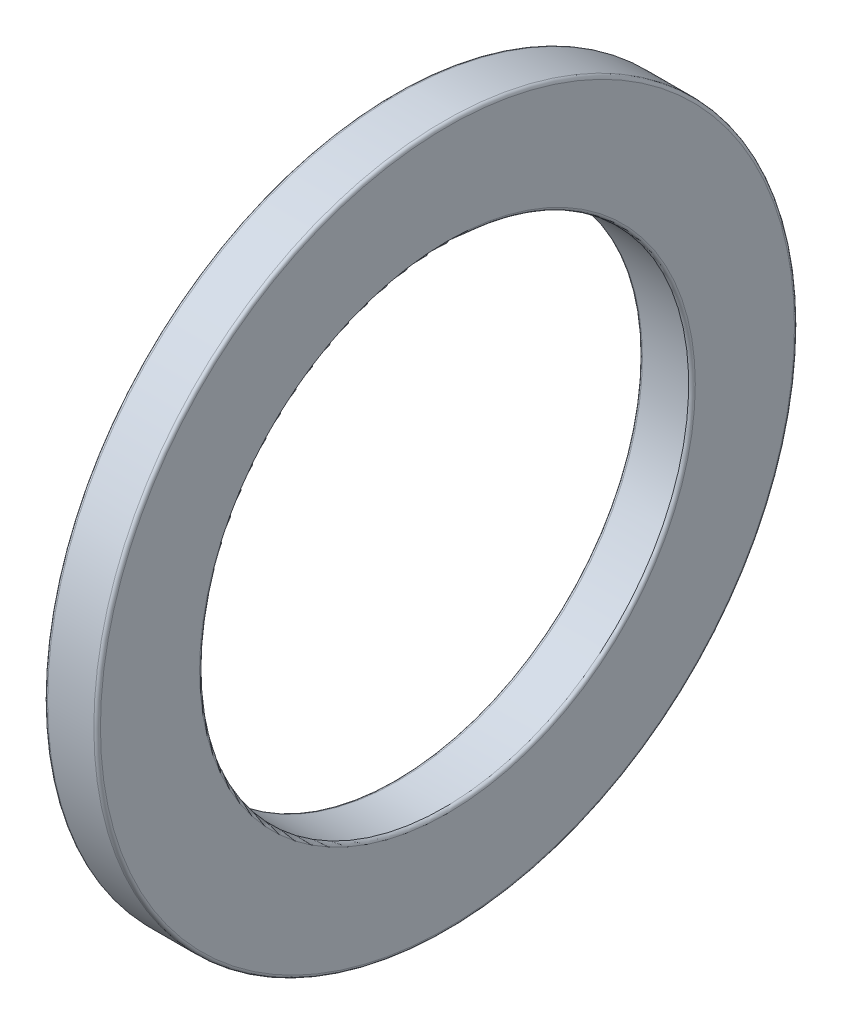
ISO-10303-21;
HEADER;
FILE_DESCRIPTION(('STEP AP214'),'2;1');
FILE_NAME('part.step','',(''),(''),'','','');
FILE_SCHEMA(('AUTOMOTIVE_DESIGN { 1 0 10303 214 1 1 1 1 }'));
ENDSEC;
DATA;
#1=APPLICATION_CONTEXT('core data for automotive mechanical design processes');
#2=APPLICATION_PROTOCOL_DEFINITION('international standard','automotive_design',2000,#1);
#3=PRODUCT_CONTEXT('',#1,'mechanical');
#4=PRODUCT('Part','Part','',(#3));
#5=PRODUCT_RELATED_PRODUCT_CATEGORY('part','',(#4));
#6=PRODUCT_DEFINITION_FORMATION('','',#4);
#7=PRODUCT_DEFINITION_CONTEXT('part definition',#1,'design');
#8=PRODUCT_DEFINITION('design','',#6,#7);
#9=PRODUCT_DEFINITION_SHAPE('','',#8);
#10=(LENGTH_UNIT() NAMED_UNIT(*) SI_UNIT(.MILLI.,.METRE.));
#11=(NAMED_UNIT(*) PLANE_ANGLE_UNIT() SI_UNIT($,.RADIAN.));
#12=(NAMED_UNIT(*) SI_UNIT($,.STERADIAN.) SOLID_ANGLE_UNIT());
#13=UNCERTAINTY_MEASURE_WITH_UNIT(LENGTH_MEASURE(1.E-05),#10,'distance_accuracy_value','');
#14=(GEOMETRIC_REPRESENTATION_CONTEXT(3) GLOBAL_UNCERTAINTY_ASSIGNED_CONTEXT((#13)) GLOBAL_UNIT_ASSIGNED_CONTEXT((#10,
#11,#12)) REPRESENTATION_CONTEXT('',''));
#15=CARTESIAN_POINT('',(0.,0.,0.));
#16=DIRECTION('',(0.,0.,1.));
#17=DIRECTION('',(1.,0.,0.));
#18=AXIS2_PLACEMENT_3D('',#15,#16,#17);
#19=CARTESIAN_POINT('',(0.,41.5358983848622,0.));
#20=DIRECTION('',(1.,0.,0.));
#21=DIRECTION('',(0.,0.,-1.));
#22=AXIS2_PLACEMENT_3D('',#19,#20,#21);
#23=PLANE('',#22);
#24=CARTESIAN_POINT('',(0.,0.,0.));
#25=DIRECTION('',(1.,0.,0.));
#26=DIRECTION('',(0.,0.,-1.));
#27=AXIS2_PLACEMENT_3D('',#24,#25,#26);
#28=CIRCLE('',#27,37.5);
#29=CARTESIAN_POINT('',(0.,0.,-37.5));
#30=VERTEX_POINT('',#29);
#31=EDGE_CURVE('E58',#30,#30,#28,.T.);
#32=ORIENTED_EDGE('',*,*,#31,.T.);
#33=EDGE_LOOP('',(#32));
#34=FACE_BOUND('',#33,.T.);
#35=CARTESIAN_POINT('',(0.,0.,0.));
#36=DIRECTION('',(-1.,0.,0.));
#37=DIRECTION('',(0.,0.,1.));
#38=AXIS2_PLACEMENT_3D('',#35,#36,#37);
#39=CIRCLE('',#38,41.5358983848622);
#40=CARTESIAN_POINT('',(0.,0.,41.5358983848622));
#41=VERTEX_POINT('',#40);
#42=EDGE_CURVE('E70',#41,#41,#39,.T.);
#43=ORIENTED_EDGE('',*,*,#42,.T.);
#44=EDGE_LOOP('',(#43));
#45=FACE_BOUND('',#44,.T.);
#46=ADVANCED_FACE('F35',(#34,#45),#23,.F.);
#47=CARTESIAN_POINT('',(0.,0.,0.));
#48=DIRECTION('',(-1.,0.,0.));
#49=DIRECTION('',(0.,0.,1.));
#50=AXIS2_PLACEMENT_3D('',#47,#48,#49);
#51=CYLINDRICAL_SURFACE('',#50,37.);
#52=CARTESIAN_POINT('',(0.5,0.,0.));
#53=DIRECTION('',(1.,0.,0.));
#54=DIRECTION('',(0.,0.,-1.));
#55=AXIS2_PLACEMENT_3D('',#52,#53,#54);
#56=CIRCLE('',#55,37.);
#57=CARTESIAN_POINT('',(0.5,0.,-37.));
#58=VERTEX_POINT('',#57);
#59=EDGE_CURVE('E61',#58,#58,#56,.F.);
#60=ORIENTED_EDGE('',*,*,#59,.T.);
#61=EDGE_LOOP('',(#60));
#62=FACE_BOUND('',#61,.T.);
#63=CARTESIAN_POINT('',(7.5,0.,0.));
#64=DIRECTION('',(-1.,0.,0.));
#65=DIRECTION('',(0.,0.,1.));
#66=AXIS2_PLACEMENT_3D('',#63,#64,#65);
#67=CIRCLE('',#66,37.);
#68=CARTESIAN_POINT('',(7.5,0.,37.));
#69=VERTEX_POINT('',#68);
#70=EDGE_CURVE('E64',#69,#69,#67,.F.);
#71=ORIENTED_EDGE('',*,*,#70,.T.);
#72=EDGE_LOOP('',(#71));
#73=FACE_BOUND('',#72,.T.);
#74=ADVANCED_FACE('F94',(#62,#73),#51,.F.);
#75=CARTESIAN_POINT('',(8.,37.,0.));
#76=DIRECTION('',(-1.,0.,0.));
#77=DIRECTION('',(0.,0.,1.));
#78=AXIS2_PLACEMENT_3D('',#75,#76,#77);
#79=PLANE('',#78);
#80=CARTESIAN_POINT('',(8.,0.,0.));
#81=DIRECTION('',(-1.,0.,0.));
#82=DIRECTION('',(0.,0.,1.));
#83=AXIS2_PLACEMENT_3D('',#80,#81,#82);
#84=CIRCLE('',#83,37.5);
#85=CARTESIAN_POINT('',(8.,0.,37.5));
#86=VERTEX_POINT('',#85);
#87=EDGE_CURVE('E10',#86,#86,#84,.T.);
#88=ORIENTED_EDGE('',*,*,#87,.T.);
#89=EDGE_LOOP('',(#88));
#90=FACE_BOUND('',#89,.T.);
#91=CARTESIAN_POINT('',(8.,0.,0.));
#92=DIRECTION('',(-1.,0.,0.));
#93=DIRECTION('',(0.,0.,1.));
#94=AXIS2_PLACEMENT_3D('',#91,#92,#93);
#95=CIRCLE('',#94,52.5);
#96=CARTESIAN_POINT('',(8.,0.,52.5));
#97=VERTEX_POINT('',#96);
#98=EDGE_CURVE('E42',#97,#97,#95,.F.);
#99=ORIENTED_EDGE('',*,*,#98,.T.);
#100=EDGE_LOOP('',(#99));
#101=FACE_BOUND('',#100,.T.);
#102=ADVANCED_FACE('F90',(#90,#101),#79,.F.);
#103=CARTESIAN_POINT('',(0.,0.,0.));
#104=DIRECTION('',(-1.,0.,0.));
#105=DIRECTION('',(0.,0.,1.));
#106=AXIS2_PLACEMENT_3D('',#103,#104,#105);
#107=CYLINDRICAL_SURFACE('',#106,53.);
#108=CARTESIAN_POINT('',(0.499999999999999,0.,0.));
#109=DIRECTION('',(1.,0.,0.));
#110=DIRECTION('',(0.,0.,-1.));
#111=AXIS2_PLACEMENT_3D('',#108,#109,#110);
#112=CIRCLE('',#111,53.);
#113=CARTESIAN_POINT('',(0.499999999999999,0.,-53.));
#114=VERTEX_POINT('',#113);
#115=EDGE_CURVE('E46',#114,#114,#112,.T.);
#116=ORIENTED_EDGE('',*,*,#115,.T.);
#117=EDGE_LOOP('',(#116));
#118=FACE_BOUND('',#117,.T.);
#119=CARTESIAN_POINT('',(7.5,0.,0.));
#120=DIRECTION('',(-1.,0.,0.));
#121=DIRECTION('',(0.,0.,1.));
#122=AXIS2_PLACEMENT_3D('',#119,#120,#121);
#123=CIRCLE('',#122,53.);
#124=CARTESIAN_POINT('',(7.5,0.,53.));
#125=VERTEX_POINT('',#124);
#126=EDGE_CURVE('E50',#125,#125,#123,.T.);
#127=ORIENTED_EDGE('',*,*,#126,.T.);
#128=EDGE_LOOP('',(#127));
#129=FACE_BOUND('',#128,.T.);
#130=ADVANCED_FACE('F84',(#118,#129),#107,.T.);
#131=CARTESIAN_POINT('',(0.,53.,0.));
#132=DIRECTION('',(1.,0.,0.));
#133=DIRECTION('',(0.,0.,-1.));
#134=AXIS2_PLACEMENT_3D('',#131,#132,#133);
#135=PLANE('',#134);
#136=CARTESIAN_POINT('',(0.,0.,0.));
#137=DIRECTION('',(1.,0.,0.));
#138=DIRECTION('',(0.,0.,-1.));
#139=AXIS2_PLACEMENT_3D('',#136,#137,#138);
#140=CIRCLE('',#139,52.5);
#141=CARTESIAN_POINT('',(0.,0.,-52.5));
#142=VERTEX_POINT('',#141);
#143=EDGE_CURVE('E55',#142,#142,#140,.F.);
#144=ORIENTED_EDGE('',*,*,#143,.T.);
#145=EDGE_LOOP('',(#144));
#146=FACE_BOUND('',#145,.T.);
#147=CARTESIAN_POINT('',(0.,0.,0.));
#148=DIRECTION('',(-1.,0.,0.));
#149=DIRECTION('',(0.,0.,1.));
#150=AXIS2_PLACEMENT_3D('',#147,#148,#149);
#151=CIRCLE('',#150,48.4641016151378);
#152=CARTESIAN_POINT('',(0.,0.,48.4641016151378));
#153=VERTEX_POINT('',#152);
#154=EDGE_CURVE('E67',#153,#153,#151,.T.);
#155=ORIENTED_EDGE('',*,*,#154,.F.);
#156=EDGE_LOOP('',(#155));
#157=FACE_BOUND('',#156,.T.);
#158=ADVANCED_FACE('F79',(#146,#157),#135,.F.);
#159=CARTESIAN_POINT('',(-0.5,0.,0.));
#160=DIRECTION('',(-1.,0.,0.));
#161=DIRECTION('',(0.,0.,1.));
#162=AXIS2_PLACEMENT_3D('',#159,#160,#161);
#163=TOROIDAL_SURFACE('',#162,45.,3.5);
#164=ORIENTED_EDGE('',*,*,#42,.F.);
#165=EDGE_LOOP('',(#164));
#166=FACE_BOUND('',#165,.T.);
#167=ORIENTED_EDGE('',*,*,#154,.T.);
#168=EDGE_LOOP('',(#167));
#169=FACE_BOUND('',#168,.T.);
#170=ADVANCED_FACE('F75',(#166,#169),#163,.F.);
#171=CARTESIAN_POINT('',(0.5,0.,0.));
#172=DIRECTION('',(1.,0.,0.));
#173=DIRECTION('',(0.,0.,-1.));
#174=AXIS2_PLACEMENT_3D('',#171,#172,#173);
#175=TOROIDAL_SURFACE('',#174,37.5,0.5);
#176=ORIENTED_EDGE('',*,*,#31,.F.);
#177=EDGE_LOOP('',(#176));
#178=FACE_BOUND('',#177,.T.);
#179=ORIENTED_EDGE('',*,*,#59,.F.);
#180=EDGE_LOOP('',(#179));
#181=FACE_BOUND('',#180,.T.);
#182=ADVANCED_FACE('F78',(#178,#181),#175,.T.);
#183=CARTESIAN_POINT('',(0.499999999999999,0.,0.));
#184=DIRECTION('',(1.,0.,0.));
#185=DIRECTION('',(0.,0.,-1.));
#186=AXIS2_PLACEMENT_3D('',#183,#184,#185);
#187=TOROIDAL_SURFACE('',#186,52.5,0.5);
#188=ORIENTED_EDGE('',*,*,#115,.F.);
#189=EDGE_LOOP('',(#188));
#190=FACE_BOUND('',#189,.T.);
#191=ORIENTED_EDGE('',*,*,#143,.F.);
#192=EDGE_LOOP('',(#191));
#193=FACE_BOUND('',#192,.T.);
#194=ADVANCED_FACE('F106',(#190,#193),#187,.T.);
#195=CARTESIAN_POINT('',(7.5,0.,0.));
#196=DIRECTION('',(-1.,0.,0.));
#197=DIRECTION('',(0.,0.,1.));
#198=AXIS2_PLACEMENT_3D('',#195,#196,#197);
#199=TOROIDAL_SURFACE('',#198,37.5,0.5);
#200=ORIENTED_EDGE('',*,*,#70,.F.);
#201=EDGE_LOOP('',(#200));
#202=FACE_BOUND('',#201,.T.);
#203=ORIENTED_EDGE('',*,*,#87,.F.);
#204=EDGE_LOOP('',(#203));
#205=FACE_BOUND('',#204,.T.);
#206=ADVANCED_FACE('F109',(#202,#205),#199,.T.);
#207=CARTESIAN_POINT('',(7.5,0.,0.));
#208=DIRECTION('',(-1.,0.,0.));
#209=DIRECTION('',(0.,0.,1.));
#210=AXIS2_PLACEMENT_3D('',#207,#208,#209);
#211=TOROIDAL_SURFACE('',#210,52.5,0.5);
#212=ORIENTED_EDGE('',*,*,#98,.F.);
#213=EDGE_LOOP('',(#212));
#214=FACE_BOUND('',#213,.T.);
#215=ORIENTED_EDGE('',*,*,#126,.F.);
#216=EDGE_LOOP('',(#215));
#217=FACE_BOUND('',#216,.T.);
#218=ADVANCED_FACE('F37',(#214,#217),#211,.T.);
#219=CLOSED_SHELL('',(#46,#74,#102,#130,#158,#170,#182,#194,#206,#218));
#220=MANIFOLD_SOLID_BREP('B2',#219);
#221=ADVANCED_BREP_SHAPE_REPRESENTATION('',(#18,#220),#14);
#222=SHAPE_DEFINITION_REPRESENTATION(#9,#221);
ENDSEC;
END-ISO-10303-21;
